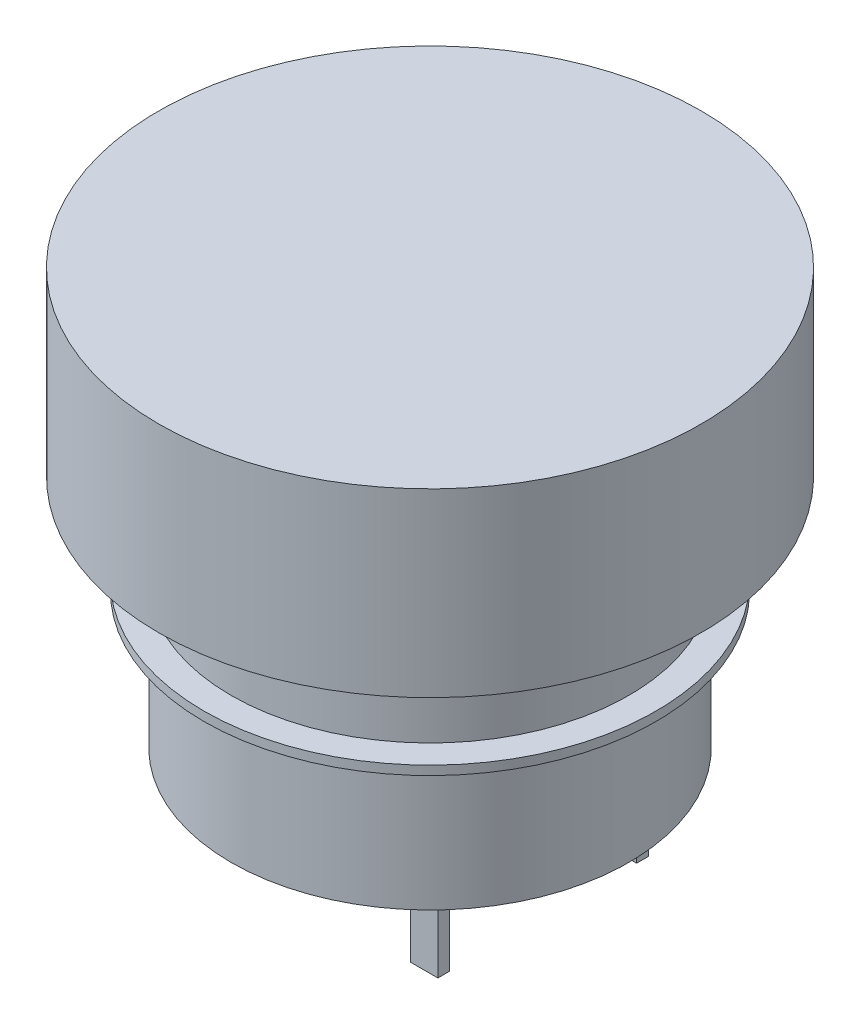
ISO-10303-21;
HEADER;
FILE_DESCRIPTION(('STEP AP214'),'2;1');
FILE_NAME('part.step','',(''),(''),'','','');
FILE_SCHEMA(('AUTOMOTIVE_DESIGN { 1 0 10303 214 1 1 1 1 }'));
ENDSEC;
DATA;
#1=APPLICATION_CONTEXT('core data for automotive mechanical design processes');
#2=APPLICATION_PROTOCOL_DEFINITION('international standard','automotive_design',2000,#1);
#3=PRODUCT_CONTEXT('',#1,'mechanical');
#4=PRODUCT('Part','Part','',(#3));
#5=PRODUCT_RELATED_PRODUCT_CATEGORY('part','',(#4));
#6=PRODUCT_DEFINITION_FORMATION('','',#4);
#7=PRODUCT_DEFINITION_CONTEXT('part definition',#1,'design');
#8=PRODUCT_DEFINITION('design','',#6,#7);
#9=PRODUCT_DEFINITION_SHAPE('','',#8);
#10=(LENGTH_UNIT() NAMED_UNIT(*) SI_UNIT(.MILLI.,.METRE.));
#11=(NAMED_UNIT(*) PLANE_ANGLE_UNIT() SI_UNIT($,.RADIAN.));
#12=(NAMED_UNIT(*) SI_UNIT($,.STERADIAN.) SOLID_ANGLE_UNIT());
#13=UNCERTAINTY_MEASURE_WITH_UNIT(LENGTH_MEASURE(1.E-05),#10,'distance_accuracy_value','');
#14=(GEOMETRIC_REPRESENTATION_CONTEXT(3) GLOBAL_UNCERTAINTY_ASSIGNED_CONTEXT((#13)) GLOBAL_UNIT_ASSIGNED_CONTEXT((#10,
#11,#12)) REPRESENTATION_CONTEXT('',''));
#15=CARTESIAN_POINT('',(0.,0.,0.));
#16=DIRECTION('',(0.,0.,1.));
#17=DIRECTION('',(1.,0.,0.));
#18=AXIS2_PLACEMENT_3D('',#15,#16,#17);
#19=CARTESIAN_POINT('',(0.,0.,0.));
#20=DIRECTION('',(0.,1.,0.));
#21=DIRECTION('',(0.,0.,1.));
#22=AXIS2_PLACEMENT_3D('',#19,#20,#21);
#23=PLANE('',#22);
#24=DIRECTION('',(0.,0.,1.));
#25=VECTOR('',#24,1.);
#26=CARTESIAN_POINT('',(12.5,0.,-10.3520151732751));
#27=LINE('',#26,#25);
#28=CARTESIAN_POINT('',(12.5,0.,-11.6479848267249));
#29=VERTEX_POINT('',#28);
#30=CARTESIAN_POINT('',(12.5,0.,-10.3520151732751));
#31=VERTEX_POINT('',#30);
#32=EDGE_CURVE('E169',#29,#31,#27,.T.);
#33=ORIENTED_EDGE('',*,*,#32,.F.);
#34=DIRECTION('',(1.,0.,0.));
#35=VECTOR('',#34,1.);
#36=CARTESIAN_POINT('',(9.5,0.,-11.6479848267249));
#37=LINE('',#36,#35);
#38=CARTESIAN_POINT('',(9.5,0.,-11.6479848267249));
#39=VERTEX_POINT('',#38);
#40=EDGE_CURVE('E182',#39,#29,#37,.T.);
#41=ORIENTED_EDGE('',*,*,#40,.F.);
#42=DIRECTION('',(0.,0.,-1.));
#43=VECTOR('',#42,1.);
#44=CARTESIAN_POINT('',(9.5,0.,-10.3520151732751));
#45=LINE('',#44,#43);
#46=CARTESIAN_POINT('',(9.5,0.,-10.3520151732751));
#47=VERTEX_POINT('',#46);
#48=EDGE_CURVE('E191',#47,#39,#45,.T.);
#49=ORIENTED_EDGE('',*,*,#48,.F.);
#50=DIRECTION('',(-1.,0.,0.));
#51=VECTOR('',#50,1.);
#52=CARTESIAN_POINT('',(9.5,0.,-10.3520151732751));
#53=LINE('',#52,#51);
#54=EDGE_CURVE('E172',#31,#47,#53,.T.);
#55=ORIENTED_EDGE('',*,*,#54,.F.);
#56=EDGE_LOOP('',(#33,#41,#49,#55));
#57=FACE_BOUND('',#56,.T.);
#58=DIRECTION('',(0.,0.,1.));
#59=VECTOR('',#58,1.);
#60=CARTESIAN_POINT('',(-9.5,0.,11.6300620715534));
#61=LINE('',#60,#59);
#62=CARTESIAN_POINT('',(-9.5,0.,10.3699379284466));
#63=VERTEX_POINT('',#62);
#64=CARTESIAN_POINT('',(-9.5,0.,11.6300620715534));
#65=VERTEX_POINT('',#64);
#66=EDGE_CURVE('E240',#63,#65,#61,.T.);
#67=ORIENTED_EDGE('',*,*,#66,.F.);
#68=DIRECTION('',(1.,0.,0.));
#69=VECTOR('',#68,1.);
#70=CARTESIAN_POINT('',(-12.5,0.,10.3699379284466));
#71=LINE('',#70,#69);
#72=CARTESIAN_POINT('',(-12.5,0.,10.3699379284466));
#73=VERTEX_POINT('',#72);
#74=EDGE_CURVE('E245',#73,#63,#71,.T.);
#75=ORIENTED_EDGE('',*,*,#74,.F.);
#76=DIRECTION('',(0.,0.,-1.));
#77=VECTOR('',#76,1.);
#78=CARTESIAN_POINT('',(-12.5,0.,11.6300620715534));
#79=LINE('',#78,#77);
#80=CARTESIAN_POINT('',(-12.5,0.,11.6300620715534));
#81=VERTEX_POINT('',#80);
#82=EDGE_CURVE('E257',#81,#73,#79,.T.);
#83=ORIENTED_EDGE('',*,*,#82,.F.);
#84=DIRECTION('',(-1.,0.,0.));
#85=VECTOR('',#84,1.);
#86=CARTESIAN_POINT('',(-12.5,0.,11.6300620715534));
#87=LINE('',#86,#85);
#88=EDGE_CURVE('E254',#65,#81,#87,.T.);
#89=ORIENTED_EDGE('',*,*,#88,.F.);
#90=EDGE_LOOP('',(#67,#75,#83,#89));
#91=FACE_BOUND('',#90,.T.);
#92=CARTESIAN_POINT('',(0.,0.,0.));
#93=DIRECTION('',(0.,1.,0.));
#94=DIRECTION('',(0.,0.,1.));
#95=AXIS2_PLACEMENT_3D('',#92,#93,#94);
#96=CIRCLE('',#95,22.);
#97=CARTESIAN_POINT('',(0.,0.,22.));
#98=VERTEX_POINT('',#97);
#99=EDGE_CURVE('E37',#98,#98,#96,.T.);
#100=ORIENTED_EDGE('',*,*,#99,.F.);
#101=EDGE_LOOP('',(#100));
#102=FACE_BOUND('',#101,.T.);
#103=DIRECTION('',(0.,0.,1.));
#104=VECTOR('',#103,1.);
#105=CARTESIAN_POINT('',(-9.49999999999999,0.,-10.3520151732751));
#106=LINE('',#105,#104);
#107=CARTESIAN_POINT('',(-9.49999999999999,0.,-11.6479848267249));
#108=VERTEX_POINT('',#107);
#109=CARTESIAN_POINT('',(-9.49999999999999,0.,-10.3520151732751));
#110=VERTEX_POINT('',#109);
#111=EDGE_CURVE('E207',#108,#110,#106,.T.);
#112=ORIENTED_EDGE('',*,*,#111,.F.);
#113=DIRECTION('',(1.,0.,0.));
#114=VECTOR('',#113,1.);
#115=CARTESIAN_POINT('',(-12.5,0.,-11.6479848267249));
#116=LINE('',#115,#114);
#117=CARTESIAN_POINT('',(-12.5,0.,-11.6479848267249));
#118=VERTEX_POINT('',#117);
#119=EDGE_CURVE('E212',#118,#108,#116,.T.);
#120=ORIENTED_EDGE('',*,*,#119,.F.);
#121=DIRECTION('',(0.,0.,-1.));
#122=VECTOR('',#121,1.);
#123=CARTESIAN_POINT('',(-12.5,0.,-10.3520151732751));
#124=LINE('',#123,#122);
#125=CARTESIAN_POINT('',(-12.5,0.,-10.3520151732751));
#126=VERTEX_POINT('',#125);
#127=EDGE_CURVE('E224',#126,#118,#124,.T.);
#128=ORIENTED_EDGE('',*,*,#127,.F.);
#129=DIRECTION('',(-1.,0.,0.));
#130=VECTOR('',#129,1.);
#131=CARTESIAN_POINT('',(-12.5,0.,-10.3520151732751));
#132=LINE('',#131,#130);
#133=EDGE_CURVE('E221',#110,#126,#132,.T.);
#134=ORIENTED_EDGE('',*,*,#133,.F.);
#135=EDGE_LOOP('',(#112,#120,#128,#134));
#136=FACE_BOUND('',#135,.T.);
#137=DIRECTION('',(0.,0.,1.));
#138=VECTOR('',#137,1.);
#139=CARTESIAN_POINT('',(12.5,0.,11.6300620715534));
#140=LINE('',#139,#138);
#141=CARTESIAN_POINT('',(12.5,0.,10.3699379284466));
#142=VERTEX_POINT('',#141);
#143=CARTESIAN_POINT('',(12.5,0.,11.6300620715534));
#144=VERTEX_POINT('',#143);
#145=EDGE_CURVE('E168',#142,#144,#140,.T.);
#146=ORIENTED_EDGE('',*,*,#145,.F.);
#147=DIRECTION('',(1.,0.,0.));
#148=VECTOR('',#147,1.);
#149=CARTESIAN_POINT('',(9.49999999999998,0.,10.3699379284466));
#150=LINE('',#149,#148);
#151=CARTESIAN_POINT('',(9.49999999999998,0.,10.3699379284466));
#152=VERTEX_POINT('',#151);
#153=EDGE_CURVE('E165',#152,#142,#150,.T.);
#154=ORIENTED_EDGE('',*,*,#153,.F.);
#155=DIRECTION('',(0.,0.,-1.));
#156=VECTOR('',#155,1.);
#157=CARTESIAN_POINT('',(9.49999999999998,0.,11.6300620715534));
#158=LINE('',#157,#156);
#159=CARTESIAN_POINT('',(9.49999999999998,0.,11.6300620715534));
#160=VERTEX_POINT('',#159);
#161=EDGE_CURVE('E55',#160,#152,#158,.T.);
#162=ORIENTED_EDGE('',*,*,#161,.F.);
#163=DIRECTION('',(-1.,0.,0.));
#164=VECTOR('',#163,1.);
#165=CARTESIAN_POINT('',(9.49999999999998,0.,11.6300620715534));
#166=LINE('',#165,#164);
#167=EDGE_CURVE('E50',#144,#160,#166,.T.);
#168=ORIENTED_EDGE('',*,*,#167,.F.);
#169=EDGE_LOOP('',(#146,#154,#162,#168));
#170=FACE_BOUND('',#169,.T.);
#171=ADVANCED_FACE('F33',(#57,#91,#102,#136,#170),#23,.F.);
#172=CARTESIAN_POINT('',(0.,15.,0.));
#173=DIRECTION('',(0.,-1.,0.));
#174=DIRECTION('',(0.,0.,-1.));
#175=AXIS2_PLACEMENT_3D('',#172,#173,#174);
#176=CYLINDRICAL_SURFACE('',#175,22.);
#177=CARTESIAN_POINT('',(0.,15.,0.));
#178=DIRECTION('',(0.,1.,0.));
#179=DIRECTION('',(0.,0.,1.));
#180=AXIS2_PLACEMENT_3D('',#177,#178,#179);
#181=CIRCLE('',#180,22.);
#182=CARTESIAN_POINT('',(0.,15.,22.));
#183=VERTEX_POINT('',#182);
#184=EDGE_CURVE('E42',#183,#183,#181,.T.);
#185=ORIENTED_EDGE('',*,*,#184,.F.);
#186=EDGE_LOOP('',(#185));
#187=FACE_BOUND('',#186,.T.);
#188=ORIENTED_EDGE('',*,*,#99,.T.);
#189=EDGE_LOOP('',(#188));
#190=FACE_BOUND('',#189,.T.);
#191=ADVANCED_FACE('F35',(#187,#190),#176,.T.);
#192=CARTESIAN_POINT('',(0.,16.,0.));
#193=DIRECTION('',(0.,-1.,0.));
#194=DIRECTION('',(0.,0.,-1.));
#195=AXIS2_PLACEMENT_3D('',#192,#193,#194);
#196=CYLINDRICAL_SURFACE('',#195,25.);
#197=CARTESIAN_POINT('',(0.,16.,0.));
#198=DIRECTION('',(0.,1.,0.));
#199=DIRECTION('',(0.,0.,1.));
#200=AXIS2_PLACEMENT_3D('',#197,#198,#199);
#201=CIRCLE('',#200,25.);
#202=CARTESIAN_POINT('',(0.,16.,25.));
#203=VERTEX_POINT('',#202);
#204=EDGE_CURVE('E283',#203,#203,#201,.T.);
#205=ORIENTED_EDGE('',*,*,#204,.F.);
#206=EDGE_LOOP('',(#205));
#207=FACE_BOUND('',#206,.T.);
#208=CARTESIAN_POINT('',(0.,15.,0.));
#209=DIRECTION('',(0.,1.,0.));
#210=DIRECTION('',(0.,0.,1.));
#211=AXIS2_PLACEMENT_3D('',#208,#209,#210);
#212=CIRCLE('',#211,25.);
#213=CARTESIAN_POINT('',(0.,15.,25.));
#214=VERTEX_POINT('',#213);
#215=EDGE_CURVE('E281',#214,#214,#212,.T.);
#216=ORIENTED_EDGE('',*,*,#215,.T.);
#217=EDGE_LOOP('',(#216));
#218=FACE_BOUND('',#217,.T.);
#219=ADVANCED_FACE('F404',(#207,#218),#196,.T.);
#220=CARTESIAN_POINT('',(0.,16.,0.));
#221=DIRECTION('',(0.,1.,0.));
#222=DIRECTION('',(0.,0.,1.));
#223=AXIS2_PLACEMENT_3D('',#220,#221,#222);
#224=PLANE('',#223);
#225=CARTESIAN_POINT('',(0.,16.,0.));
#226=DIRECTION('',(0.,1.,0.));
#227=DIRECTION('',(0.,0.,1.));
#228=AXIS2_PLACEMENT_3D('',#225,#226,#227);
#229=CIRCLE('',#228,22.);
#230=CARTESIAN_POINT('',(0.,16.,22.));
#231=VERTEX_POINT('',#230);
#232=EDGE_CURVE('E11',#231,#231,#229,.T.);
#233=ORIENTED_EDGE('',*,*,#232,.F.);
#234=EDGE_LOOP('',(#233));
#235=FACE_BOUND('',#234,.T.);
#236=ORIENTED_EDGE('',*,*,#204,.T.);
#237=EDGE_LOOP('',(#236));
#238=FACE_BOUND('',#237,.T.);
#239=ADVANCED_FACE('F401',(#235,#238),#224,.T.);
#240=CARTESIAN_POINT('',(0.,15.,0.));
#241=DIRECTION('',(0.,1.,0.));
#242=DIRECTION('',(0.,0.,1.));
#243=AXIS2_PLACEMENT_3D('',#240,#241,#242);
#244=PLANE('',#243);
#245=ORIENTED_EDGE('',*,*,#184,.T.);
#246=EDGE_LOOP('',(#245));
#247=FACE_BOUND('',#246,.T.);
#248=ORIENTED_EDGE('',*,*,#215,.F.);
#249=EDGE_LOOP('',(#248));
#250=FACE_BOUND('',#249,.T.);
#251=ADVANCED_FACE('F399',(#247,#250),#244,.F.);
#252=CARTESIAN_POINT('',(0.,26.,0.));
#253=DIRECTION('',(0.,-1.,0.));
#254=DIRECTION('',(0.,0.,-1.));
#255=AXIS2_PLACEMENT_3D('',#252,#253,#254);
#256=CYLINDRICAL_SURFACE('',#255,22.);
#257=CARTESIAN_POINT('',(0.,26.,0.));
#258=DIRECTION('',(0.,1.,0.));
#259=DIRECTION('',(0.,0.,1.));
#260=AXIS2_PLACEMENT_3D('',#257,#258,#259);
#261=CIRCLE('',#260,22.);
#262=CARTESIAN_POINT('',(0.,26.,22.));
#263=VERTEX_POINT('',#262);
#264=EDGE_CURVE('E277',#263,#263,#261,.T.);
#265=ORIENTED_EDGE('',*,*,#264,.F.);
#266=EDGE_LOOP('',(#265));
#267=FACE_BOUND('',#266,.T.);
#268=ORIENTED_EDGE('',*,*,#232,.T.);
#269=EDGE_LOOP('',(#268));
#270=FACE_BOUND('',#269,.T.);
#271=ADVANCED_FACE('F395',(#267,#270),#256,.T.);
#272=CARTESIAN_POINT('',(0.,46.,0.));
#273=DIRECTION('',(0.,-1.,0.));
#274=DIRECTION('',(0.,0.,-1.));
#275=AXIS2_PLACEMENT_3D('',#272,#273,#274);
#276=CYLINDRICAL_SURFACE('',#275,30.);
#277=CARTESIAN_POINT('',(0.,46.,0.));
#278=DIRECTION('',(0.,1.,0.));
#279=DIRECTION('',(0.,0.,1.));
#280=AXIS2_PLACEMENT_3D('',#277,#278,#279);
#281=CIRCLE('',#280,30.);
#282=CARTESIAN_POINT('',(0.,46.,30.));
#283=VERTEX_POINT('',#282);
#284=EDGE_CURVE('E274',#283,#283,#281,.T.);
#285=ORIENTED_EDGE('',*,*,#284,.F.);
#286=EDGE_LOOP('',(#285));
#287=FACE_BOUND('',#286,.T.);
#288=CARTESIAN_POINT('',(0.,26.,0.));
#289=DIRECTION('',(0.,1.,0.));
#290=DIRECTION('',(0.,0.,1.));
#291=AXIS2_PLACEMENT_3D('',#288,#289,#290);
#292=CIRCLE('',#291,30.);
#293=CARTESIAN_POINT('',(0.,26.,30.));
#294=VERTEX_POINT('',#293);
#295=EDGE_CURVE('E273',#294,#294,#292,.T.);
#296=ORIENTED_EDGE('',*,*,#295,.T.);
#297=EDGE_LOOP('',(#296));
#298=FACE_BOUND('',#297,.T.);
#299=ADVANCED_FACE('F388',(#287,#298),#276,.T.);
#300=CARTESIAN_POINT('',(0.,46.,0.));
#301=DIRECTION('',(0.,1.,0.));
#302=DIRECTION('',(0.,0.,1.));
#303=AXIS2_PLACEMENT_3D('',#300,#301,#302);
#304=PLANE('',#303);
#305=ORIENTED_EDGE('',*,*,#284,.T.);
#306=EDGE_LOOP('',(#305));
#307=FACE_BOUND('',#306,.T.);
#308=ADVANCED_FACE('F385',(#307),#304,.T.);
#309=CARTESIAN_POINT('',(0.,26.,0.));
#310=DIRECTION('',(0.,1.,0.));
#311=DIRECTION('',(0.,0.,1.));
#312=AXIS2_PLACEMENT_3D('',#309,#310,#311);
#313=PLANE('',#312);
#314=ORIENTED_EDGE('',*,*,#264,.T.);
#315=EDGE_LOOP('',(#314));
#316=FACE_BOUND('',#315,.T.);
#317=ORIENTED_EDGE('',*,*,#295,.F.);
#318=EDGE_LOOP('',(#317));
#319=FACE_BOUND('',#318,.T.);
#320=ADVANCED_FACE('F383',(#316,#319),#313,.F.);
#321=CARTESIAN_POINT('',(-9.5,-10.,11.6300620715534));
#322=DIRECTION('',(-1.,0.,0.));
#323=DIRECTION('',(0.,0.,1.));
#324=AXIS2_PLACEMENT_3D('',#321,#322,#323);
#325=PLANE('',#324);
#326=ORIENTED_EDGE('',*,*,#66,.T.);
#327=DIRECTION('',(0.,1.,0.));
#328=VECTOR('',#327,1.);
#329=CARTESIAN_POINT('',(-9.5,-10.,11.6300620715534));
#330=LINE('',#329,#328);
#331=CARTESIAN_POINT('',(-9.5,-10.,11.6300620715534));
#332=VERTEX_POINT('',#331);
#333=EDGE_CURVE('E270',#332,#65,#330,.T.);
#334=ORIENTED_EDGE('',*,*,#333,.F.);
#335=DIRECTION('',(0.,0.,1.));
#336=VECTOR('',#335,1.);
#337=CARTESIAN_POINT('',(-9.5,-10.,11.6300620715534));
#338=LINE('',#337,#336);
#339=CARTESIAN_POINT('',(-9.5,-10.,10.3699379284466));
#340=VERTEX_POINT('',#339);
#341=EDGE_CURVE('E241',#340,#332,#338,.T.);
#342=ORIENTED_EDGE('',*,*,#341,.F.);
#343=DIRECTION('',(0.,1.,0.));
#344=VECTOR('',#343,1.);
#345=CARTESIAN_POINT('',(-9.5,-10.,10.3699379284466));
#346=LINE('',#345,#344);
#347=EDGE_CURVE('E251',#340,#63,#346,.T.);
#348=ORIENTED_EDGE('',*,*,#347,.T.);
#349=EDGE_LOOP('',(#326,#334,#342,#348));
#350=FACE_BOUND('',#349,.T.);
#351=ADVANCED_FACE('F379',(#350),#325,.F.);
#352=CARTESIAN_POINT('',(-12.5,-10.,11.6300620715534));
#353=DIRECTION('',(0.,0.,-1.));
#354=DIRECTION('',(-1.,0.,0.));
#355=AXIS2_PLACEMENT_3D('',#352,#353,#354);
#356=PLANE('',#355);
#357=ORIENTED_EDGE('',*,*,#88,.T.);
#358=DIRECTION('',(0.,1.,0.));
#359=VECTOR('',#358,1.);
#360=CARTESIAN_POINT('',(-12.5,-10.,11.6300620715534));
#361=LINE('',#360,#359);
#362=CARTESIAN_POINT('',(-12.5,-10.,11.6300620715534));
#363=VERTEX_POINT('',#362);
#364=EDGE_CURVE('E267',#363,#81,#361,.T.);
#365=ORIENTED_EDGE('',*,*,#364,.F.);
#366=DIRECTION('',(-1.,0.,0.));
#367=VECTOR('',#366,1.);
#368=CARTESIAN_POINT('',(-12.5,-10.,11.6300620715534));
#369=LINE('',#368,#367);
#370=EDGE_CURVE('E244',#332,#363,#369,.T.);
#371=ORIENTED_EDGE('',*,*,#370,.F.);
#372=ORIENTED_EDGE('',*,*,#333,.T.);
#373=EDGE_LOOP('',(#357,#365,#371,#372));
#374=FACE_BOUND('',#373,.T.);
#375=ADVANCED_FACE('F375',(#374),#356,.F.);
#376=CARTESIAN_POINT('',(-12.5,-10.,11.6300620715534));
#377=DIRECTION('',(1.,0.,0.));
#378=DIRECTION('',(0.,0.,-1.));
#379=AXIS2_PLACEMENT_3D('',#376,#377,#378);
#380=PLANE('',#379);
#381=ORIENTED_EDGE('',*,*,#82,.T.);
#382=DIRECTION('',(0.,1.,0.));
#383=VECTOR('',#382,1.);
#384=CARTESIAN_POINT('',(-12.5,-10.,10.3699379284466));
#385=LINE('',#384,#383);
#386=CARTESIAN_POINT('',(-12.5,-10.,10.3699379284466));
#387=VERTEX_POINT('',#386);
#388=EDGE_CURVE('E264',#387,#73,#385,.T.);
#389=ORIENTED_EDGE('',*,*,#388,.F.);
#390=DIRECTION('',(0.,0.,-1.));
#391=VECTOR('',#390,1.);
#392=CARTESIAN_POINT('',(-12.5,-10.,11.6300620715534));
#393=LINE('',#392,#391);
#394=EDGE_CURVE('E247',#363,#387,#393,.T.);
#395=ORIENTED_EDGE('',*,*,#394,.F.);
#396=ORIENTED_EDGE('',*,*,#364,.T.);
#397=EDGE_LOOP('',(#381,#389,#395,#396));
#398=FACE_BOUND('',#397,.T.);
#399=ADVANCED_FACE('F371',(#398),#380,.F.);
#400=CARTESIAN_POINT('',(-12.5,-10.,10.3699379284466));
#401=DIRECTION('',(0.,0.,1.));
#402=DIRECTION('',(1.,0.,0.));
#403=AXIS2_PLACEMENT_3D('',#400,#401,#402);
#404=PLANE('',#403);
#405=ORIENTED_EDGE('',*,*,#74,.T.);
#406=ORIENTED_EDGE('',*,*,#347,.F.);
#407=DIRECTION('',(1.,0.,0.));
#408=VECTOR('',#407,1.);
#409=CARTESIAN_POINT('',(-12.5,-10.,10.3699379284466));
#410=LINE('',#409,#408);
#411=EDGE_CURVE('E249',#387,#340,#410,.T.);
#412=ORIENTED_EDGE('',*,*,#411,.F.);
#413=ORIENTED_EDGE('',*,*,#388,.T.);
#414=EDGE_LOOP('',(#405,#406,#412,#413));
#415=FACE_BOUND('',#414,.T.);
#416=ADVANCED_FACE('F367',(#415),#404,.F.);
#417=CARTESIAN_POINT('',(0.,-10.,0.));
#418=DIRECTION('',(0.,-1.,0.));
#419=DIRECTION('',(0.,0.,-1.));
#420=AXIS2_PLACEMENT_3D('',#417,#418,#419);
#421=PLANE('',#420);
#422=ORIENTED_EDGE('',*,*,#341,.T.);
#423=ORIENTED_EDGE('',*,*,#370,.T.);
#424=ORIENTED_EDGE('',*,*,#394,.T.);
#425=ORIENTED_EDGE('',*,*,#411,.T.);
#426=EDGE_LOOP('',(#422,#423,#424,#425));
#427=FACE_BOUND('',#426,.T.);
#428=ADVANCED_FACE('F363',(#427),#421,.T.);
#429=CARTESIAN_POINT('',(-9.49999999999999,-10.,-10.3520151732751));
#430=DIRECTION('',(-1.,0.,0.));
#431=DIRECTION('',(0.,0.,1.));
#432=AXIS2_PLACEMENT_3D('',#429,#430,#431);
#433=PLANE('',#432);
#434=ORIENTED_EDGE('',*,*,#111,.T.);
#435=DIRECTION('',(0.,1.,0.));
#436=VECTOR('',#435,1.);
#437=CARTESIAN_POINT('',(-9.49999999999999,-10.,-10.3520151732751));
#438=LINE('',#437,#436);
#439=CARTESIAN_POINT('',(-9.49999999999999,-10.,-10.3520151732751));
#440=VERTEX_POINT('',#439);
#441=EDGE_CURVE('E237',#440,#110,#438,.T.);
#442=ORIENTED_EDGE('',*,*,#441,.F.);
#443=DIRECTION('',(0.,0.,1.));
#444=VECTOR('',#443,1.);
#445=CARTESIAN_POINT('',(-9.49999999999999,-10.,-10.3520151732751));
#446=LINE('',#445,#444);
#447=CARTESIAN_POINT('',(-9.49999999999999,-10.,-11.6479848267249));
#448=VERTEX_POINT('',#447);
#449=EDGE_CURVE('E208',#448,#440,#446,.T.);
#450=ORIENTED_EDGE('',*,*,#449,.F.);
#451=DIRECTION('',(0.,1.,0.));
#452=VECTOR('',#451,1.);
#453=CARTESIAN_POINT('',(-9.49999999999999,-10.,-11.6479848267249));
#454=LINE('',#453,#452);
#455=EDGE_CURVE('E218',#448,#108,#454,.T.);
#456=ORIENTED_EDGE('',*,*,#455,.T.);
#457=EDGE_LOOP('',(#434,#442,#450,#456));
#458=FACE_BOUND('',#457,.T.);
#459=ADVANCED_FACE('F359',(#458),#433,.F.);
#460=CARTESIAN_POINT('',(-12.5,-10.,-10.3520151732751));
#461=DIRECTION('',(0.,0.,-1.));
#462=DIRECTION('',(-1.,0.,0.));
#463=AXIS2_PLACEMENT_3D('',#460,#461,#462);
#464=PLANE('',#463);
#465=ORIENTED_EDGE('',*,*,#133,.T.);
#466=DIRECTION('',(0.,1.,0.));
#467=VECTOR('',#466,1.);
#468=CARTESIAN_POINT('',(-12.5,-10.,-10.3520151732751));
#469=LINE('',#468,#467);
#470=CARTESIAN_POINT('',(-12.5,-10.,-10.3520151732751));
#471=VERTEX_POINT('',#470);
#472=EDGE_CURVE('E234',#471,#126,#469,.T.);
#473=ORIENTED_EDGE('',*,*,#472,.F.);
#474=DIRECTION('',(-1.,0.,0.));
#475=VECTOR('',#474,1.);
#476=CARTESIAN_POINT('',(-12.5,-10.,-10.3520151732751));
#477=LINE('',#476,#475);
#478=EDGE_CURVE('E211',#440,#471,#477,.T.);
#479=ORIENTED_EDGE('',*,*,#478,.F.);
#480=ORIENTED_EDGE('',*,*,#441,.T.);
#481=EDGE_LOOP('',(#465,#473,#479,#480));
#482=FACE_BOUND('',#481,.T.);
#483=ADVANCED_FACE('F355',(#482),#464,.F.);
#484=CARTESIAN_POINT('',(-12.5,-10.,-10.3520151732751));
#485=DIRECTION('',(1.,0.,0.));
#486=DIRECTION('',(0.,0.,-1.));
#487=AXIS2_PLACEMENT_3D('',#484,#485,#486);
#488=PLANE('',#487);
#489=ORIENTED_EDGE('',*,*,#127,.T.);
#490=DIRECTION('',(0.,1.,0.));
#491=VECTOR('',#490,1.);
#492=CARTESIAN_POINT('',(-12.5,-10.,-11.6479848267249));
#493=LINE('',#492,#491);
#494=CARTESIAN_POINT('',(-12.5,-10.,-11.6479848267249));
#495=VERTEX_POINT('',#494);
#496=EDGE_CURVE('E231',#495,#118,#493,.T.);
#497=ORIENTED_EDGE('',*,*,#496,.F.);
#498=DIRECTION('',(0.,0.,-1.));
#499=VECTOR('',#498,1.);
#500=CARTESIAN_POINT('',(-12.5,-10.,-10.3520151732751));
#501=LINE('',#500,#499);
#502=EDGE_CURVE('E214',#471,#495,#501,.T.);
#503=ORIENTED_EDGE('',*,*,#502,.F.);
#504=ORIENTED_EDGE('',*,*,#472,.T.);
#505=EDGE_LOOP('',(#489,#497,#503,#504));
#506=FACE_BOUND('',#505,.T.);
#507=ADVANCED_FACE('F351',(#506),#488,.F.);
#508=CARTESIAN_POINT('',(-12.5,-10.,-11.6479848267249));
#509=DIRECTION('',(0.,0.,1.));
#510=DIRECTION('',(1.,0.,0.));
#511=AXIS2_PLACEMENT_3D('',#508,#509,#510);
#512=PLANE('',#511);
#513=ORIENTED_EDGE('',*,*,#119,.T.);
#514=ORIENTED_EDGE('',*,*,#455,.F.);
#515=DIRECTION('',(1.,0.,0.));
#516=VECTOR('',#515,1.);
#517=CARTESIAN_POINT('',(-12.5,-10.,-11.6479848267249));
#518=LINE('',#517,#516);
#519=EDGE_CURVE('E216',#495,#448,#518,.T.);
#520=ORIENTED_EDGE('',*,*,#519,.F.);
#521=ORIENTED_EDGE('',*,*,#496,.T.);
#522=EDGE_LOOP('',(#513,#514,#520,#521));
#523=FACE_BOUND('',#522,.T.);
#524=ADVANCED_FACE('F347',(#523),#512,.F.);
#525=CARTESIAN_POINT('',(0.,-10.,0.));
#526=DIRECTION('',(0.,-1.,0.));
#527=DIRECTION('',(0.,0.,-1.));
#528=AXIS2_PLACEMENT_3D('',#525,#526,#527);
#529=PLANE('',#528);
#530=ORIENTED_EDGE('',*,*,#449,.T.);
#531=ORIENTED_EDGE('',*,*,#478,.T.);
#532=ORIENTED_EDGE('',*,*,#502,.T.);
#533=ORIENTED_EDGE('',*,*,#519,.T.);
#534=EDGE_LOOP('',(#530,#531,#532,#533));
#535=FACE_BOUND('',#534,.T.);
#536=ADVANCED_FACE('F343',(#535),#529,.T.);
#537=CARTESIAN_POINT('',(12.5,-10.,-10.3520151732751));
#538=DIRECTION('',(-1.,0.,0.));
#539=DIRECTION('',(0.,0.,1.));
#540=AXIS2_PLACEMENT_3D('',#537,#538,#539);
#541=PLANE('',#540);
#542=ORIENTED_EDGE('',*,*,#32,.T.);
#543=DIRECTION('',(0.,1.,0.));
#544=VECTOR('',#543,1.);
#545=CARTESIAN_POINT('',(12.5,-10.,-10.3520151732751));
#546=LINE('',#545,#544);
#547=CARTESIAN_POINT('',(12.5,-10.,-10.3520151732751));
#548=VERTEX_POINT('',#547);
#549=EDGE_CURVE('E204',#548,#31,#546,.T.);
#550=ORIENTED_EDGE('',*,*,#549,.F.);
#551=DIRECTION('',(0.,0.,1.));
#552=VECTOR('',#551,1.);
#553=CARTESIAN_POINT('',(12.5,-10.,-10.3520151732751));
#554=LINE('',#553,#552);
#555=CARTESIAN_POINT('',(12.5,-10.,-11.6479848267249));
#556=VERTEX_POINT('',#555);
#557=EDGE_CURVE('E178',#556,#548,#554,.T.);
#558=ORIENTED_EDGE('',*,*,#557,.F.);
#559=DIRECTION('',(0.,1.,0.));
#560=VECTOR('',#559,1.);
#561=CARTESIAN_POINT('',(12.5,-10.,-11.6479848267249));
#562=LINE('',#561,#560);
#563=EDGE_CURVE('E187',#556,#29,#562,.T.);
#564=ORIENTED_EDGE('',*,*,#563,.T.);
#565=EDGE_LOOP('',(#542,#550,#558,#564));
#566=FACE_BOUND('',#565,.T.);
#567=ADVANCED_FACE('F339',(#566),#541,.F.);
#568=CARTESIAN_POINT('',(9.5,-10.,-10.3520151732751));
#569=DIRECTION('',(0.,0.,-1.));
#570=DIRECTION('',(-1.,0.,0.));
#571=AXIS2_PLACEMENT_3D('',#568,#569,#570);
#572=PLANE('',#571);
#573=ORIENTED_EDGE('',*,*,#54,.T.);
#574=DIRECTION('',(0.,1.,0.));
#575=VECTOR('',#574,1.);
#576=CARTESIAN_POINT('',(9.5,-10.,-10.3520151732751));
#577=LINE('',#576,#575);
#578=CARTESIAN_POINT('',(9.5,-10.,-10.3520151732751));
#579=VERTEX_POINT('',#578);
#580=EDGE_CURVE('E201',#579,#47,#577,.T.);
#581=ORIENTED_EDGE('',*,*,#580,.F.);
#582=DIRECTION('',(-1.,0.,0.));
#583=VECTOR('',#582,1.);
#584=CARTESIAN_POINT('',(9.5,-10.,-10.3520151732751));
#585=LINE('',#584,#583);
#586=EDGE_CURVE('E181',#548,#579,#585,.T.);
#587=ORIENTED_EDGE('',*,*,#586,.F.);
#588=ORIENTED_EDGE('',*,*,#549,.T.);
#589=EDGE_LOOP('',(#573,#581,#587,#588));
#590=FACE_BOUND('',#589,.T.);
#591=ADVANCED_FACE('F335',(#590),#572,.F.);
#592=CARTESIAN_POINT('',(9.5,-10.,-10.3520151732751));
#593=DIRECTION('',(1.,0.,0.));
#594=DIRECTION('',(0.,0.,-1.));
#595=AXIS2_PLACEMENT_3D('',#592,#593,#594);
#596=PLANE('',#595);
#597=ORIENTED_EDGE('',*,*,#48,.T.);
#598=DIRECTION('',(0.,1.,0.));
#599=VECTOR('',#598,1.);
#600=CARTESIAN_POINT('',(9.5,-10.,-11.6479848267249));
#601=LINE('',#600,#599);
#602=CARTESIAN_POINT('',(9.5,-10.,-11.6479848267249));
#603=VERTEX_POINT('',#602);
#604=EDGE_CURVE('E198',#603,#39,#601,.T.);
#605=ORIENTED_EDGE('',*,*,#604,.F.);
#606=DIRECTION('',(0.,0.,-1.));
#607=VECTOR('',#606,1.);
#608=CARTESIAN_POINT('',(9.5,-10.,-10.3520151732751));
#609=LINE('',#608,#607);
#610=EDGE_CURVE('E184',#579,#603,#609,.T.);
#611=ORIENTED_EDGE('',*,*,#610,.F.);
#612=ORIENTED_EDGE('',*,*,#580,.T.);
#613=EDGE_LOOP('',(#597,#605,#611,#612));
#614=FACE_BOUND('',#613,.T.);
#615=ADVANCED_FACE('F331',(#614),#596,.F.);
#616=CARTESIAN_POINT('',(9.5,-10.,-11.6479848267249));
#617=DIRECTION('',(0.,0.,1.));
#618=DIRECTION('',(1.,0.,0.));
#619=AXIS2_PLACEMENT_3D('',#616,#617,#618);
#620=PLANE('',#619);
#621=ORIENTED_EDGE('',*,*,#40,.T.);
#622=ORIENTED_EDGE('',*,*,#563,.F.);
#623=DIRECTION('',(1.,0.,0.));
#624=VECTOR('',#623,1.);
#625=CARTESIAN_POINT('',(9.5,-10.,-11.6479848267249));
#626=LINE('',#625,#624);
#627=EDGE_CURVE('E186',#603,#556,#626,.T.);
#628=ORIENTED_EDGE('',*,*,#627,.F.);
#629=ORIENTED_EDGE('',*,*,#604,.T.);
#630=EDGE_LOOP('',(#621,#622,#628,#629));
#631=FACE_BOUND('',#630,.T.);
#632=ADVANCED_FACE('F327',(#631),#620,.F.);
#633=CARTESIAN_POINT('',(0.,-10.,0.));
#634=DIRECTION('',(0.,-1.,0.));
#635=DIRECTION('',(0.,0.,-1.));
#636=AXIS2_PLACEMENT_3D('',#633,#634,#635);
#637=PLANE('',#636);
#638=ORIENTED_EDGE('',*,*,#557,.T.);
#639=ORIENTED_EDGE('',*,*,#586,.T.);
#640=ORIENTED_EDGE('',*,*,#610,.T.);
#641=ORIENTED_EDGE('',*,*,#627,.T.);
#642=EDGE_LOOP('',(#638,#639,#640,#641));
#643=FACE_BOUND('',#642,.T.);
#644=ADVANCED_FACE('F324',(#643),#637,.T.);
#645=CARTESIAN_POINT('',(12.5,-10.,11.6300620715534));
#646=DIRECTION('',(-1.,0.,0.));
#647=DIRECTION('',(0.,0.,1.));
#648=AXIS2_PLACEMENT_3D('',#645,#646,#647);
#649=PLANE('',#648);
#650=ORIENTED_EDGE('',*,*,#145,.T.);
#651=DIRECTION('',(0.,1.,0.));
#652=VECTOR('',#651,1.);
#653=CARTESIAN_POINT('',(12.5,-10.,11.6300620715534));
#654=LINE('',#653,#652);
#655=CARTESIAN_POINT('',(12.5,-10.,11.6300620715534));
#656=VERTEX_POINT('',#655);
#657=EDGE_CURVE('E149',#656,#144,#654,.T.);
#658=ORIENTED_EDGE('',*,*,#657,.F.);
#659=DIRECTION('',(0.,0.,1.));
#660=VECTOR('',#659,1.);
#661=CARTESIAN_POINT('',(12.5,-10.,11.6300620715534));
#662=LINE('',#661,#660);
#663=CARTESIAN_POINT('',(12.5,-10.,10.3699379284466));
#664=VERTEX_POINT('',#663);
#665=EDGE_CURVE('E156',#664,#656,#662,.T.);
#666=ORIENTED_EDGE('',*,*,#665,.F.);
#667=DIRECTION('',(0.,1.,0.));
#668=VECTOR('',#667,1.);
#669=CARTESIAN_POINT('',(12.5,-10.,10.3699379284466));
#670=LINE('',#669,#668);
#671=EDGE_CURVE('E302',#664,#142,#670,.T.);
#672=ORIENTED_EDGE('',*,*,#671,.T.);
#673=EDGE_LOOP('',(#650,#658,#666,#672));
#674=FACE_BOUND('',#673,.T.);
#675=ADVANCED_FACE('F167',(#674),#649,.F.);
#676=CARTESIAN_POINT('',(9.49999999999998,-10.,11.6300620715534));
#677=DIRECTION('',(0.,0.,-1.));
#678=DIRECTION('',(-1.,0.,0.));
#679=AXIS2_PLACEMENT_3D('',#676,#677,#678);
#680=PLANE('',#679);
#681=ORIENTED_EDGE('',*,*,#167,.T.);
#682=DIRECTION('',(0.,1.,0.));
#683=VECTOR('',#682,1.);
#684=CARTESIAN_POINT('',(9.49999999999998,-10.,11.6300620715534));
#685=LINE('',#684,#683);
#686=CARTESIAN_POINT('',(9.49999999999998,-10.,11.6300620715534));
#687=VERTEX_POINT('',#686);
#688=EDGE_CURVE('E152',#687,#160,#685,.T.);
#689=ORIENTED_EDGE('',*,*,#688,.F.);
#690=DIRECTION('',(-1.,0.,0.));
#691=VECTOR('',#690,1.);
#692=CARTESIAN_POINT('',(9.49999999999998,-10.,11.6300620715534));
#693=LINE('',#692,#691);
#694=EDGE_CURVE('E145',#656,#687,#693,.T.);
#695=ORIENTED_EDGE('',*,*,#694,.F.);
#696=ORIENTED_EDGE('',*,*,#657,.T.);
#697=EDGE_LOOP('',(#681,#689,#695,#696));
#698=FACE_BOUND('',#697,.T.);
#699=ADVANCED_FACE('F147',(#698),#680,.F.);
#700=CARTESIAN_POINT('',(9.49999999999998,-10.,11.6300620715534));
#701=DIRECTION('',(1.,0.,0.));
#702=DIRECTION('',(0.,0.,-1.));
#703=AXIS2_PLACEMENT_3D('',#700,#701,#702);
#704=PLANE('',#703);
#705=ORIENTED_EDGE('',*,*,#161,.T.);
#706=DIRECTION('',(0.,1.,0.));
#707=VECTOR('',#706,1.);
#708=CARTESIAN_POINT('',(9.49999999999998,-10.,10.3699379284466));
#709=LINE('',#708,#707);
#710=CARTESIAN_POINT('',(9.49999999999998,-10.,10.3699379284466));
#711=VERTEX_POINT('',#710);
#712=EDGE_CURVE('E174',#711,#152,#709,.T.);
#713=ORIENTED_EDGE('',*,*,#712,.F.);
#714=DIRECTION('',(0.,0.,-1.));
#715=VECTOR('',#714,1.);
#716=CARTESIAN_POINT('',(9.49999999999998,-10.,11.6300620715534));
#717=LINE('',#716,#715);
#718=EDGE_CURVE('E155',#687,#711,#717,.T.);
#719=ORIENTED_EDGE('',*,*,#718,.F.);
#720=ORIENTED_EDGE('',*,*,#688,.T.);
#721=EDGE_LOOP('',(#705,#713,#719,#720));
#722=FACE_BOUND('',#721,.T.);
#723=ADVANCED_FACE('F311',(#722),#704,.F.);
#724=CARTESIAN_POINT('',(9.49999999999998,-10.,10.3699379284466));
#725=DIRECTION('',(0.,0.,1.));
#726=DIRECTION('',(1.,0.,0.));
#727=AXIS2_PLACEMENT_3D('',#724,#725,#726);
#728=PLANE('',#727);
#729=ORIENTED_EDGE('',*,*,#153,.T.);
#730=ORIENTED_EDGE('',*,*,#671,.F.);
#731=DIRECTION('',(1.,0.,0.));
#732=VECTOR('',#731,1.);
#733=CARTESIAN_POINT('',(9.49999999999998,-10.,10.3699379284466));
#734=LINE('',#733,#732);
#735=EDGE_CURVE('E161',#711,#664,#734,.T.);
#736=ORIENTED_EDGE('',*,*,#735,.F.);
#737=ORIENTED_EDGE('',*,*,#712,.T.);
#738=EDGE_LOOP('',(#729,#730,#736,#737));
#739=FACE_BOUND('',#738,.T.);
#740=ADVANCED_FACE('F301',(#739),#728,.F.);
#741=CARTESIAN_POINT('',(0.,-10.,0.));
#742=DIRECTION('',(0.,-1.,0.));
#743=DIRECTION('',(0.,0.,-1.));
#744=AXIS2_PLACEMENT_3D('',#741,#742,#743);
#745=PLANE('',#744);
#746=ORIENTED_EDGE('',*,*,#665,.T.);
#747=ORIENTED_EDGE('',*,*,#694,.T.);
#748=ORIENTED_EDGE('',*,*,#718,.T.);
#749=ORIENTED_EDGE('',*,*,#735,.T.);
#750=EDGE_LOOP('',(#746,#747,#748,#749));
#751=FACE_BOUND('',#750,.T.);
#752=ADVANCED_FACE('F159',(#751),#745,.T.);
#753=CLOSED_SHELL('',(#171,#191,#219,#239,#251,#271,#299,#308,#320,#351,#375,#399,#416,#428,
#459,#483,#507,#524,#536,#567,#591,#615,#632,#644,#675,#699,#723,#740,#752));
#754=MANIFOLD_SOLID_BREP('B2',#753);
#755=ADVANCED_BREP_SHAPE_REPRESENTATION('',(#18,#754),#14);
#756=SHAPE_DEFINITION_REPRESENTATION(#9,#755);
ENDSEC;
END-ISO-10303-21;
